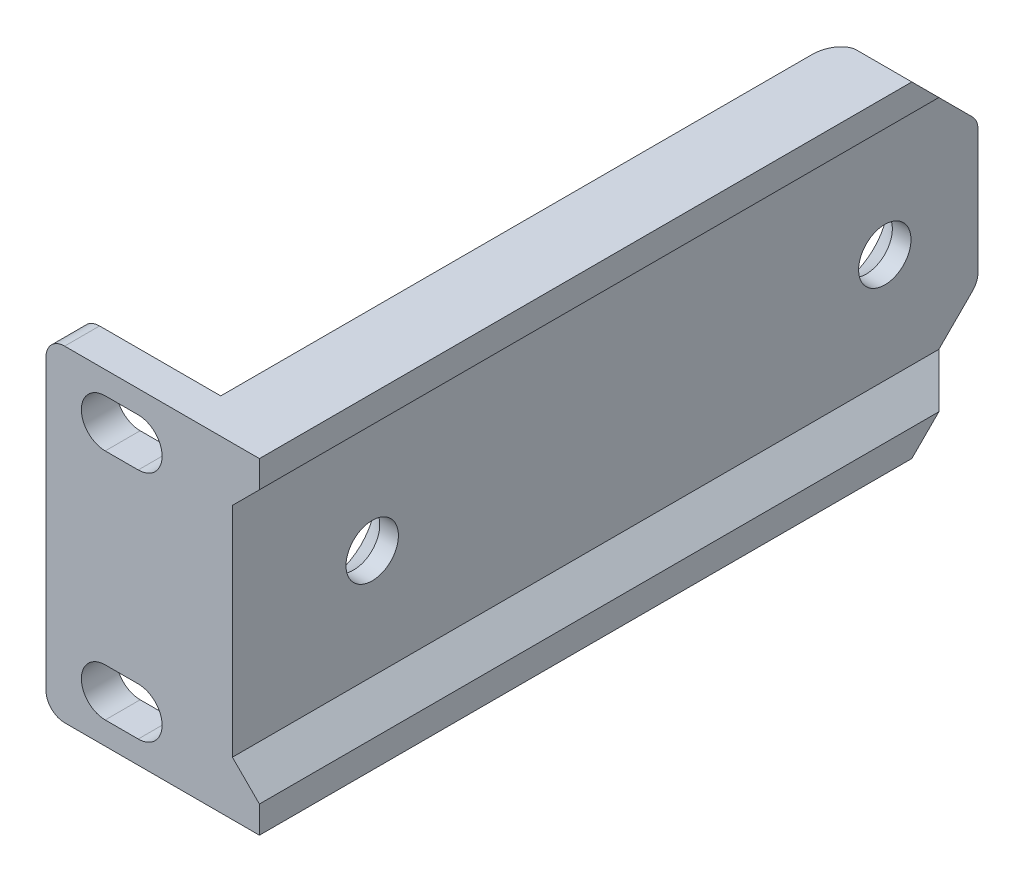
ISO-10303-21;
HEADER;
FILE_DESCRIPTION(('STEP AP214'),'2;1');
FILE_NAME('part.step','',(''),(''),'','','');
FILE_SCHEMA(('AUTOMOTIVE_DESIGN { 1 0 10303 214 1 1 1 1 }'));
ENDSEC;
DATA;
#1=APPLICATION_CONTEXT('core data for automotive mechanical design processes');
#2=APPLICATION_PROTOCOL_DEFINITION('international standard','automotive_design',2000,#1);
#3=PRODUCT_CONTEXT('',#1,'mechanical');
#4=PRODUCT('Part','Part','',(#3));
#5=PRODUCT_RELATED_PRODUCT_CATEGORY('part','',(#4));
#6=PRODUCT_DEFINITION_FORMATION('','',#4);
#7=PRODUCT_DEFINITION_CONTEXT('part definition',#1,'design');
#8=PRODUCT_DEFINITION('design','',#6,#7);
#9=PRODUCT_DEFINITION_SHAPE('','',#8);
#10=(LENGTH_UNIT() NAMED_UNIT(*) SI_UNIT(.MILLI.,.METRE.));
#11=(NAMED_UNIT(*) PLANE_ANGLE_UNIT() SI_UNIT($,.RADIAN.));
#12=(NAMED_UNIT(*) SI_UNIT($,.STERADIAN.) SOLID_ANGLE_UNIT());
#13=UNCERTAINTY_MEASURE_WITH_UNIT(LENGTH_MEASURE(1.E-05),#10,'distance_accuracy_value','');
#14=(GEOMETRIC_REPRESENTATION_CONTEXT(3) GLOBAL_UNCERTAINTY_ASSIGNED_CONTEXT((#13)) GLOBAL_UNIT_ASSIGNED_CONTEXT((#10,
#11,#12)) REPRESENTATION_CONTEXT('',''));
#15=CARTESIAN_POINT('',(0.,0.,0.));
#16=DIRECTION('',(0.,0.,1.));
#17=DIRECTION('',(1.,0.,0.));
#18=AXIS2_PLACEMENT_3D('',#15,#16,#17);
#19=CARTESIAN_POINT('',(-25.4,22.225,0.));
#20=DIRECTION('',(0.,0.,-1.));
#21=DIRECTION('',(-1.,0.,0.));
#22=AXIS2_PLACEMENT_3D('',#19,#20,#21);
#23=PLANE('',#22);
#24=DIRECTION('',(1.,0.,0.));
#25=VECTOR('',#24,1.);
#26=CARTESIAN_POINT('',(-17.33005,12.6238,0.));
#27=LINE('',#26,#25);
#28=CARTESIAN_POINT('',(-17.33005,12.6238,0.));
#29=VERTEX_POINT('',#28);
#30=CARTESIAN_POINT('',(-12.83245,12.6238,0.));
#31=VERTEX_POINT('',#30);
#32=EDGE_CURVE('E396',#29,#31,#27,.T.);
#33=ORIENTED_EDGE('',*,*,#32,.F.);
#34=CARTESIAN_POINT('',(-17.33005,15.875,0.));
#35=DIRECTION('',(0.,0.,1.));
#36=DIRECTION('',(1.,0.,0.));
#37=AXIS2_PLACEMENT_3D('',#34,#35,#36);
#38=CIRCLE('',#37,3.2512);
#39=CARTESIAN_POINT('',(-17.33005,19.1262,0.));
#40=VERTEX_POINT('',#39);
#41=EDGE_CURVE('E394',#40,#29,#38,.T.);
#42=ORIENTED_EDGE('',*,*,#41,.F.);
#43=DIRECTION('',(-1.,0.,0.));
#44=VECTOR('',#43,1.);
#45=CARTESIAN_POINT('',(-17.33005,19.1262,0.));
#46=LINE('',#45,#44);
#47=CARTESIAN_POINT('',(-12.83245,19.1262,0.));
#48=VERTEX_POINT('',#47);
#49=EDGE_CURVE('E403',#48,#40,#46,.T.);
#50=ORIENTED_EDGE('',*,*,#49,.F.);
#51=CARTESIAN_POINT('',(-12.83245,15.875,0.));
#52=DIRECTION('',(0.,0.,1.));
#53=DIRECTION('',(1.,0.,0.));
#54=AXIS2_PLACEMENT_3D('',#51,#52,#53);
#55=CIRCLE('',#54,3.2512);
#56=EDGE_CURVE('E400',#31,#48,#55,.T.);
#57=ORIENTED_EDGE('',*,*,#56,.F.);
#58=EDGE_LOOP('',(#33,#42,#50,#57));
#59=FACE_BOUND('',#58,.T.);
#60=DIRECTION('',(1.,0.,0.));
#61=VECTOR('',#60,1.);
#62=CARTESIAN_POINT('',(-17.33005,-19.1262,0.));
#63=LINE('',#62,#61);
#64=CARTESIAN_POINT('',(-17.33005,-19.1262,0.));
#65=VERTEX_POINT('',#64);
#66=CARTESIAN_POINT('',(-12.83245,-19.1262,0.));
#67=VERTEX_POINT('',#66);
#68=EDGE_CURVE('E417',#65,#67,#63,.T.);
#69=ORIENTED_EDGE('',*,*,#68,.F.);
#70=CARTESIAN_POINT('',(-17.33005,-15.875,0.));
#71=DIRECTION('',(0.,0.,1.));
#72=DIRECTION('',(-1.,0.,0.));
#73=AXIS2_PLACEMENT_3D('',#70,#71,#72);
#74=CIRCLE('',#73,3.2512);
#75=CARTESIAN_POINT('',(-17.33005,-12.6238,0.));
#76=VERTEX_POINT('',#75);
#77=EDGE_CURVE('E312',#76,#65,#74,.T.);
#78=ORIENTED_EDGE('',*,*,#77,.F.);
#79=DIRECTION('',(-1.,0.,0.));
#80=VECTOR('',#79,1.);
#81=CARTESIAN_POINT('',(-17.33005,-12.6238,0.));
#82=LINE('',#81,#80);
#83=CARTESIAN_POINT('',(-12.83245,-12.6238,0.));
#84=VERTEX_POINT('',#83);
#85=EDGE_CURVE('E423',#84,#76,#82,.T.);
#86=ORIENTED_EDGE('',*,*,#85,.F.);
#87=CARTESIAN_POINT('',(-12.83245,-15.875,0.));
#88=DIRECTION('',(0.,0.,1.));
#89=DIRECTION('',(-1.,0.,0.));
#90=AXIS2_PLACEMENT_3D('',#87,#88,#89);
#91=CIRCLE('',#90,3.2512);
#92=EDGE_CURVE('E420',#67,#84,#91,.T.);
#93=ORIENTED_EDGE('',*,*,#92,.F.);
#94=EDGE_LOOP('',(#69,#78,#86,#93));
#95=FACE_BOUND('',#94,.T.);
#96=DIRECTION('',(0.,-1.,0.));
#97=VECTOR('',#96,1.);
#98=CARTESIAN_POINT('',(-25.4,22.225,0.));
#99=LINE('',#98,#97);
#100=CARTESIAN_POINT('',(-25.4,19.685,0.));
#101=VERTEX_POINT('',#100);
#102=CARTESIAN_POINT('',(-25.4,-19.685,0.));
#103=VERTEX_POINT('',#102);
#104=EDGE_CURVE('E249',#101,#103,#99,.T.);
#105=ORIENTED_EDGE('',*,*,#104,.T.);
#106=CARTESIAN_POINT('',(-22.86,-19.685,0.));
#107=DIRECTION('',(0.,0.,-1.));
#108=DIRECTION('',(-1.,0.,0.));
#109=AXIS2_PLACEMENT_3D('',#106,#107,#108);
#110=CIRCLE('',#109,2.54);
#111=CARTESIAN_POINT('',(-22.86,-22.225,0.));
#112=VERTEX_POINT('',#111);
#113=EDGE_CURVE('E298',#103,#112,#110,.F.);
#114=ORIENTED_EDGE('',*,*,#113,.T.);
#115=DIRECTION('',(1.,0.,0.));
#116=VECTOR('',#115,1.);
#117=CARTESIAN_POINT('',(-25.4,-22.225,0.));
#118=LINE('',#117,#116);
#119=CARTESIAN_POINT('',(3.68300000000001,-22.225,0.));
#120=VERTEX_POINT('',#119);
#121=EDGE_CURVE('E233',#112,#120,#118,.T.);
#122=ORIENTED_EDGE('',*,*,#121,.T.);
#123=DIRECTION('',(0.,1.,0.));
#124=VECTOR('',#123,1.);
#125=CARTESIAN_POINT('',(3.68300000000001,-22.225,0.));
#126=LINE('',#125,#124);
#127=CARTESIAN_POINT('',(3.68300000000001,-18.542,0.));
#128=VERTEX_POINT('',#127);
#129=EDGE_CURVE('E409',#120,#128,#126,.T.);
#130=ORIENTED_EDGE('',*,*,#129,.T.);
#131=DIRECTION('',(-0.70710678118655,0.707106781186545,0.));
#132=VECTOR('',#131,1.);
#133=CARTESIAN_POINT('',(-31.2420000000001,16.3829999999999,0.));
#134=LINE('',#133,#132);
#135=CARTESIAN_POINT('',(0.,-14.859,0.));
#136=VERTEX_POINT('',#135);
#137=EDGE_CURVE('E57',#128,#136,#134,.T.);
#138=ORIENTED_EDGE('',*,*,#137,.T.);
#139=DIRECTION('',(0.,-1.,0.));
#140=VECTOR('',#139,1.);
#141=CARTESIAN_POINT('',(0.,22.225,0.));
#142=LINE('',#141,#140);
#143=CARTESIAN_POINT('',(0.,14.859,0.));
#144=VERTEX_POINT('',#143);
#145=EDGE_CURVE('E265',#144,#136,#142,.T.);
#146=ORIENTED_EDGE('',*,*,#145,.F.);
#147=DIRECTION('',(0.707106781186544,0.707106781186552,0.));
#148=VECTOR('',#147,1.);
#149=CARTESIAN_POINT('',(-9.01699999999984,5.84200000000002,0.));
#150=LINE('',#149,#148);
#151=CARTESIAN_POINT('',(3.683,18.542,0.));
#152=VERTEX_POINT('',#151);
#153=EDGE_CURVE('E42',#144,#152,#150,.T.);
#154=ORIENTED_EDGE('',*,*,#153,.T.);
#155=DIRECTION('',(0.,1.,0.));
#156=VECTOR('',#155,1.);
#157=CARTESIAN_POINT('',(3.683,22.225,0.));
#158=LINE('',#157,#156);
#159=CARTESIAN_POINT('',(3.683,22.225,0.));
#160=VERTEX_POINT('',#159);
#161=EDGE_CURVE('E238',#152,#160,#158,.T.);
#162=ORIENTED_EDGE('',*,*,#161,.T.);
#163=DIRECTION('',(1.,0.,0.));
#164=VECTOR('',#163,1.);
#165=CARTESIAN_POINT('',(-25.4,22.225,0.));
#166=LINE('',#165,#164);
#167=CARTESIAN_POINT('',(-22.86,22.225,0.));
#168=VERTEX_POINT('',#167);
#169=EDGE_CURVE('E231',#168,#160,#166,.T.);
#170=ORIENTED_EDGE('',*,*,#169,.F.);
#171=CARTESIAN_POINT('',(-22.86,19.685,0.));
#172=DIRECTION('',(0.,0.,-1.));
#173=DIRECTION('',(-1.,0.,0.));
#174=AXIS2_PLACEMENT_3D('',#171,#172,#173);
#175=CIRCLE('',#174,2.54);
#176=EDGE_CURVE('E296',#168,#101,#175,.F.);
#177=ORIENTED_EDGE('',*,*,#176,.T.);
#178=EDGE_LOOP('',(#105,#114,#122,#130,#138,#146,#154,#162,#170,#177));
#179=FACE_BOUND('',#178,.T.);
#180=ADVANCED_FACE('F34',(#59,#95,#179),#23,.F.);
#181=CARTESIAN_POINT('',(0.,22.225,0.));
#182=DIRECTION('',(-1.,0.,0.));
#183=DIRECTION('',(0.,0.,1.));
#184=AXIS2_PLACEMENT_3D('',#181,#182,#183);
#185=PLANE('',#184);
#186=CARTESIAN_POINT('',(0.,0.,-19.05));
#187=DIRECTION('',(-1.,0.,0.));
#188=DIRECTION('',(0.,0.,1.));
#189=AXIS2_PLACEMENT_3D('',#186,#187,#188);
#190=CIRCLE('',#189,3.57123999999999);
#191=CARTESIAN_POINT('',(0.,0.,-15.47876));
#192=VERTEX_POINT('',#191);
#193=EDGE_CURVE('E314',#192,#192,#190,.T.);
#194=ORIENTED_EDGE('',*,*,#193,.T.);
#195=EDGE_LOOP('',(#194));
#196=FACE_BOUND('',#195,.T.);
#197=CARTESIAN_POINT('',(0.,0.,-88.9));
#198=DIRECTION('',(-1.,0.,0.));
#199=DIRECTION('',(0.,0.,1.));
#200=AXIS2_PLACEMENT_3D('',#197,#198,#199);
#201=CIRCLE('',#200,3.57123999999999);
#202=CARTESIAN_POINT('',(0.,0.,-85.32876));
#203=VERTEX_POINT('',#202);
#204=EDGE_CURVE('E309',#203,#203,#201,.T.);
#205=ORIENTED_EDGE('',*,*,#204,.T.);
#206=EDGE_LOOP('',(#205));
#207=FACE_BOUND('',#206,.T.);
#208=ORIENTED_EDGE('',*,*,#145,.T.);
#209=DIRECTION('',(0.,0.,-1.));
#210=VECTOR('',#209,1.);
#211=CARTESIAN_POINT('',(0.,-14.859,0.));
#212=LINE('',#211,#210);
#213=CARTESIAN_POINT('',(0.,-14.859,-96.266));
#214=VERTEX_POINT('',#213);
#215=EDGE_CURVE('E49',#136,#214,#212,.T.);
#216=ORIENTED_EDGE('',*,*,#215,.T.);
#217=DIRECTION('',(0.,0.707106781186548,-0.707106781186548));
#218=VECTOR('',#217,1.);
#219=CARTESIAN_POINT('',(0.,-44.45,-66.675));
#220=LINE('',#219,#218);
#221=CARTESIAN_POINT('',(0.,-10.2689487757861,-100.856051224214));
#222=VERTEX_POINT('',#221);
#223=EDGE_CURVE('E216',#214,#222,#220,.T.);
#224=ORIENTED_EDGE('',*,*,#223,.T.);
#225=CARTESIAN_POINT('',(0.,-8.47289755157233,-99.06));
#226=DIRECTION('',(-1.,0.,0.));
#227=DIRECTION('',(0.,0.,1.));
#228=AXIS2_PLACEMENT_3D('',#225,#226,#227);
#229=CIRCLE('',#228,2.54);
#230=CARTESIAN_POINT('',(0.,-8.47289755157233,-101.6));
#231=VERTEX_POINT('',#230);
#232=EDGE_CURVE('E335',#222,#231,#229,.F.);
#233=ORIENTED_EDGE('',*,*,#232,.T.);
#234=DIRECTION('',(0.,-1.,0.));
#235=VECTOR('',#234,1.);
#236=CARTESIAN_POINT('',(0.,22.225,-101.6));
#237=LINE('',#236,#235);
#238=CARTESIAN_POINT('',(0.,8.47289755157233,-101.6));
#239=VERTEX_POINT('',#238);
#240=EDGE_CURVE('E262',#239,#231,#237,.T.);
#241=ORIENTED_EDGE('',*,*,#240,.F.);
#242=CARTESIAN_POINT('',(0.,8.47289755157233,-99.06));
#243=DIRECTION('',(-1.,0.,0.));
#244=DIRECTION('',(0.,0.,1.));
#245=AXIS2_PLACEMENT_3D('',#242,#243,#244);
#246=CIRCLE('',#245,2.54);
#247=CARTESIAN_POINT('',(0.,10.2689487757861,-100.856051224214));
#248=VERTEX_POINT('',#247);
#249=EDGE_CURVE('E337',#239,#248,#246,.F.);
#250=ORIENTED_EDGE('',*,*,#249,.T.);
#251=DIRECTION('',(0.,0.707106781186548,0.707106781186548));
#252=VECTOR('',#251,1.);
#253=CARTESIAN_POINT('',(0.,66.675,-44.45));
#254=LINE('',#253,#252);
#255=CARTESIAN_POINT('',(0.,14.859,-96.266));
#256=VERTEX_POINT('',#255);
#257=EDGE_CURVE('E376',#248,#256,#254,.T.);
#258=ORIENTED_EDGE('',*,*,#257,.T.);
#259=DIRECTION('',(0.,0.,1.));
#260=VECTOR('',#259,1.);
#261=CARTESIAN_POINT('',(0.,14.859,0.));
#262=LINE('',#261,#260);
#263=EDGE_CURVE('E346',#256,#144,#262,.T.);
#264=ORIENTED_EDGE('',*,*,#263,.T.);
#265=EDGE_LOOP('',(#208,#216,#224,#233,#241,#250,#258,#264));
#266=FACE_BOUND('',#265,.T.);
#267=ADVANCED_FACE('F378',(#196,#207,#266),#185,.F.);
#268=CARTESIAN_POINT('',(0.,22.225,-101.6));
#269=DIRECTION('',(0.,0.,1.));
#270=DIRECTION('',(1.,0.,0.));
#271=AXIS2_PLACEMENT_3D('',#268,#269,#270);
#272=PLANE('',#271);
#273=DIRECTION('',(0.,-1.,0.));
#274=VECTOR('',#273,1.);
#275=CARTESIAN_POINT('',(-3.81,22.225,-101.6));
#276=LINE('',#275,#274);
#277=CARTESIAN_POINT('',(-3.81,-8.47289755157233,-101.6));
#278=VERTEX_POINT('',#277);
#279=CARTESIAN_POINT('',(-3.81,8.47289755157233,-101.6));
#280=VERTEX_POINT('',#279);
#281=EDGE_CURVE('E329',#278,#280,#276,.F.);
#282=ORIENTED_EDGE('',*,*,#281,.T.);
#283=DIRECTION('',(-1.,0.,0.));
#284=VECTOR('',#283,1.);
#285=CARTESIAN_POINT('',(0.,8.47289755157233,-101.6));
#286=LINE('',#285,#284);
#287=EDGE_CURVE('E333',#280,#239,#286,.F.);
#288=ORIENTED_EDGE('',*,*,#287,.T.);
#289=ORIENTED_EDGE('',*,*,#240,.T.);
#290=DIRECTION('',(-1.,0.,0.));
#291=VECTOR('',#290,1.);
#292=CARTESIAN_POINT('',(0.,-8.47289755157233,-101.6));
#293=LINE('',#292,#291);
#294=EDGE_CURVE('E331',#231,#278,#293,.T.);
#295=ORIENTED_EDGE('',*,*,#294,.T.);
#296=EDGE_LOOP('',(#282,#288,#289,#295));
#297=FACE_BOUND('',#296,.T.);
#298=ADVANCED_FACE('F460',(#297),#272,.F.);
#299=CARTESIAN_POINT('',(-6.35,22.225,-101.6));
#300=DIRECTION('',(1.,0.,0.));
#301=DIRECTION('',(0.,0.,-1.));
#302=AXIS2_PLACEMENT_3D('',#299,#300,#301);
#303=PLANE('',#302);
#304=DIRECTION('',(0.,0.,1.));
#305=VECTOR('',#304,1.);
#306=CARTESIAN_POINT('',(-6.35,22.225,-101.6));
#307=LINE('',#306,#305);
#308=CARTESIAN_POINT('',(-6.35,22.225,-85.3078975515723));
#309=VERTEX_POINT('',#308);
#310=CARTESIAN_POINT('',(-6.34999999999999,22.225,-4.7625));
#311=VERTEX_POINT('',#310);
#312=EDGE_CURVE('E244',#309,#311,#307,.T.);
#313=ORIENTED_EDGE('',*,*,#312,.F.);
#314=DIRECTION('',(0.,0.707106781186548,0.707106781186548));
#315=VECTOR('',#314,1.);
#316=CARTESIAN_POINT('',(-6.35,14.0789487757862,-93.4539487757862));
#317=LINE('',#316,#315);
#318=CARTESIAN_POINT('',(-6.35,8.47289755157233,-99.06));
#319=VERTEX_POINT('',#318);
#320=EDGE_CURVE('E327',#309,#319,#317,.F.);
#321=ORIENTED_EDGE('',*,*,#320,.T.);
#322=DIRECTION('',(0.,-1.,0.));
#323=VECTOR('',#322,1.);
#324=CARTESIAN_POINT('',(-6.35,22.225,-99.06));
#325=LINE('',#324,#323);
#326=CARTESIAN_POINT('',(-6.35,-8.47289755157233,-99.06));
#327=VERTEX_POINT('',#326);
#328=EDGE_CURVE('E323',#319,#327,#325,.T.);
#329=ORIENTED_EDGE('',*,*,#328,.T.);
#330=DIRECTION('',(0.,0.707106781186548,-0.707106781186548));
#331=VECTOR('',#330,1.);
#332=CARTESIAN_POINT('',(-6.35,8.14605122421384,-115.678948775786));
#333=LINE('',#332,#331);
#334=CARTESIAN_POINT('',(-6.35,-22.225,-85.3078975515723));
#335=VERTEX_POINT('',#334);
#336=EDGE_CURVE('E325',#327,#335,#333,.F.);
#337=ORIENTED_EDGE('',*,*,#336,.T.);
#338=DIRECTION('',(0.,0.,1.));
#339=VECTOR('',#338,1.);
#340=CARTESIAN_POINT('',(-6.35,-22.225,-101.6));
#341=LINE('',#340,#339);
#342=CARTESIAN_POINT('',(-6.34999999999999,-22.225,-4.7625));
#343=VERTEX_POINT('',#342);
#344=EDGE_CURVE('E236',#335,#343,#341,.T.);
#345=ORIENTED_EDGE('',*,*,#344,.T.);
#346=DIRECTION('',(0.,-1.,0.));
#347=VECTOR('',#346,1.);
#348=CARTESIAN_POINT('',(-6.34999999999999,22.225,-4.7625));
#349=LINE('',#348,#347);
#350=EDGE_CURVE('E259',#311,#343,#349,.T.);
#351=ORIENTED_EDGE('',*,*,#350,.F.);
#352=EDGE_LOOP('',(#313,#321,#329,#337,#345,#351));
#353=FACE_BOUND('',#352,.T.);
#354=CARTESIAN_POINT('',(-6.34999999999999,0.,-19.05));
#355=DIRECTION('',(-1.,0.,0.));
#356=DIRECTION('',(0.,0.,1.));
#357=AXIS2_PLACEMENT_3D('',#354,#355,#356);
#358=CIRCLE('',#357,6.8804917);
#359=CARTESIAN_POINT('',(-6.34999999999999,0.,-12.1695083));
#360=VERTEX_POINT('',#359);
#361=EDGE_CURVE('E381',#360,#360,#358,.T.);
#362=ORIENTED_EDGE('',*,*,#361,.F.);
#363=EDGE_LOOP('',(#362));
#364=FACE_BOUND('',#363,.T.);
#365=CARTESIAN_POINT('',(-6.34999999999999,0.,-88.9));
#366=DIRECTION('',(-1.,0.,0.));
#367=DIRECTION('',(0.,0.,1.));
#368=AXIS2_PLACEMENT_3D('',#365,#366,#367);
#369=CIRCLE('',#368,6.8804917);
#370=CARTESIAN_POINT('',(-6.34999999999999,0.,-82.0195083));
#371=VERTEX_POINT('',#370);
#372=EDGE_CURVE('E317',#371,#371,#369,.T.);
#373=ORIENTED_EDGE('',*,*,#372,.F.);
#374=EDGE_LOOP('',(#373));
#375=FACE_BOUND('',#374,.T.);
#376=ADVANCED_FACE('F485',(#353,#364,#375),#303,.F.);
#377=CARTESIAN_POINT('',(-6.34999999999999,22.225,-4.7625));
#378=DIRECTION('',(0.,0.,1.));
#379=DIRECTION('',(1.,0.,0.));
#380=AXIS2_PLACEMENT_3D('',#377,#378,#379);
#381=PLANE('',#380);
#382=DIRECTION('',(-1.,0.,0.));
#383=VECTOR('',#382,1.);
#384=CARTESIAN_POINT('',(-6.34999999999999,19.1262,-4.7625));
#385=LINE('',#384,#383);
#386=CARTESIAN_POINT('',(-12.83245,19.1262,-4.7625));
#387=VERTEX_POINT('',#386);
#388=CARTESIAN_POINT('',(-17.33005,19.1262,-4.7625));
#389=VERTEX_POINT('',#388);
#390=EDGE_CURVE('E285',#387,#389,#385,.T.);
#391=ORIENTED_EDGE('',*,*,#390,.T.);
#392=CARTESIAN_POINT('',(-17.33005,15.875,-4.7625));
#393=DIRECTION('',(0.,0.,1.));
#394=DIRECTION('',(1.,0.,0.));
#395=AXIS2_PLACEMENT_3D('',#392,#393,#394);
#396=CIRCLE('',#395,3.2512);
#397=CARTESIAN_POINT('',(-17.33005,12.6238,-4.7625));
#398=VERTEX_POINT('',#397);
#399=EDGE_CURVE('E288',#389,#398,#396,.T.);
#400=ORIENTED_EDGE('',*,*,#399,.T.);
#401=DIRECTION('',(1.,0.,0.));
#402=VECTOR('',#401,1.);
#403=CARTESIAN_POINT('',(-6.34999999999999,12.6238,-4.7625));
#404=LINE('',#403,#402);
#405=CARTESIAN_POINT('',(-12.83245,12.6238,-4.7625));
#406=VERTEX_POINT('',#405);
#407=EDGE_CURVE('E279',#398,#406,#404,.T.);
#408=ORIENTED_EDGE('',*,*,#407,.T.);
#409=CARTESIAN_POINT('',(-12.83245,15.875,-4.7625));
#410=DIRECTION('',(0.,0.,1.));
#411=DIRECTION('',(1.,0.,0.));
#412=AXIS2_PLACEMENT_3D('',#409,#410,#411);
#413=CIRCLE('',#412,3.2512);
#414=EDGE_CURVE('E282',#406,#387,#413,.T.);
#415=ORIENTED_EDGE('',*,*,#414,.T.);
#416=EDGE_LOOP('',(#391,#400,#408,#415));
#417=FACE_BOUND('',#416,.T.);
#418=DIRECTION('',(-1.,0.,0.));
#419=VECTOR('',#418,1.);
#420=CARTESIAN_POINT('',(-6.34999999999999,-12.6238,-4.7625));
#421=LINE('',#420,#419);
#422=CARTESIAN_POINT('',(-12.83245,-12.6238,-4.7625));
#423=VERTEX_POINT('',#422);
#424=CARTESIAN_POINT('',(-17.33005,-12.6238,-4.7625));
#425=VERTEX_POINT('',#424);
#426=EDGE_CURVE('E273',#423,#425,#421,.T.);
#427=ORIENTED_EDGE('',*,*,#426,.T.);
#428=CARTESIAN_POINT('',(-17.33005,-15.875,-4.7625));
#429=DIRECTION('',(0.,0.,1.));
#430=DIRECTION('',(1.,0.,0.));
#431=AXIS2_PLACEMENT_3D('',#428,#429,#430);
#432=CIRCLE('',#431,3.2512);
#433=CARTESIAN_POINT('',(-17.33005,-19.1262,-4.7625));
#434=VERTEX_POINT('',#433);
#435=EDGE_CURVE('E276',#425,#434,#432,.T.);
#436=ORIENTED_EDGE('',*,*,#435,.T.);
#437=DIRECTION('',(1.,0.,0.));
#438=VECTOR('',#437,1.);
#439=CARTESIAN_POINT('',(-6.34999999999999,-19.1262,-4.7625));
#440=LINE('',#439,#438);
#441=CARTESIAN_POINT('',(-12.83245,-19.1262,-4.7625));
#442=VERTEX_POINT('',#441);
#443=EDGE_CURVE('E267',#434,#442,#440,.T.);
#444=ORIENTED_EDGE('',*,*,#443,.T.);
#445=CARTESIAN_POINT('',(-12.83245,-15.875,-4.7625));
#446=DIRECTION('',(0.,0.,1.));
#447=DIRECTION('',(1.,0.,0.));
#448=AXIS2_PLACEMENT_3D('',#445,#446,#447);
#449=CIRCLE('',#448,3.2512);
#450=EDGE_CURVE('E270',#442,#423,#449,.T.);
#451=ORIENTED_EDGE('',*,*,#450,.T.);
#452=EDGE_LOOP('',(#427,#436,#444,#451));
#453=FACE_BOUND('',#452,.T.);
#454=DIRECTION('',(-1.,0.,0.));
#455=VECTOR('',#454,1.);
#456=CARTESIAN_POINT('',(-6.34999999999999,-22.225,-4.7625));
#457=LINE('',#456,#455);
#458=CARTESIAN_POINT('',(-22.86,-22.225,-4.7625));
#459=VERTEX_POINT('',#458);
#460=EDGE_CURVE('E245',#343,#459,#457,.T.);
#461=ORIENTED_EDGE('',*,*,#460,.T.);
#462=CARTESIAN_POINT('',(-22.86,-19.685,-4.7625));
#463=DIRECTION('',(0.,0.,1.));
#464=DIRECTION('',(1.,0.,0.));
#465=AXIS2_PLACEMENT_3D('',#462,#463,#464);
#466=CIRCLE('',#465,2.54);
#467=CARTESIAN_POINT('',(-25.4,-19.685,-4.7625));
#468=VERTEX_POINT('',#467);
#469=EDGE_CURVE('E304',#459,#468,#466,.F.);
#470=ORIENTED_EDGE('',*,*,#469,.T.);
#471=DIRECTION('',(0.,-1.,0.));
#472=VECTOR('',#471,1.);
#473=CARTESIAN_POINT('',(-25.4,22.225,-4.7625));
#474=LINE('',#473,#472);
#475=CARTESIAN_POINT('',(-25.4,19.685,-4.7625));
#476=VERTEX_POINT('',#475);
#477=EDGE_CURVE('E256',#476,#468,#474,.T.);
#478=ORIENTED_EDGE('',*,*,#477,.F.);
#479=CARTESIAN_POINT('',(-22.86,19.685,-4.7625));
#480=DIRECTION('',(0.,0.,1.));
#481=DIRECTION('',(1.,0.,0.));
#482=AXIS2_PLACEMENT_3D('',#479,#480,#481);
#483=CIRCLE('',#482,2.54);
#484=CARTESIAN_POINT('',(-22.86,22.225,-4.7625));
#485=VERTEX_POINT('',#484);
#486=EDGE_CURVE('E302',#476,#485,#483,.F.);
#487=ORIENTED_EDGE('',*,*,#486,.T.);
#488=DIRECTION('',(-1.,0.,0.));
#489=VECTOR('',#488,1.);
#490=CARTESIAN_POINT('',(-6.34999999999999,22.225,-4.7625));
#491=LINE('',#490,#489);
#492=EDGE_CURVE('E247',#311,#485,#491,.T.);
#493=ORIENTED_EDGE('',*,*,#492,.F.);
#494=ORIENTED_EDGE('',*,*,#350,.T.);
#495=EDGE_LOOP('',(#461,#470,#478,#487,#493,#494));
#496=FACE_BOUND('',#495,.T.);
#497=ADVANCED_FACE('F490',(#417,#453,#496),#381,.F.);
#498=CARTESIAN_POINT('',(-25.4,22.225,-4.7625));
#499=DIRECTION('',(1.,0.,0.));
#500=DIRECTION('',(0.,0.,-1.));
#501=AXIS2_PLACEMENT_3D('',#498,#499,#500);
#502=PLANE('',#501);
#503=ORIENTED_EDGE('',*,*,#477,.T.);
#504=DIRECTION('',(0.,0.,1.));
#505=VECTOR('',#504,1.);
#506=CARTESIAN_POINT('',(-25.4,-19.685,-4.7625));
#507=LINE('',#506,#505);
#508=EDGE_CURVE('E293',#468,#103,#507,.T.);
#509=ORIENTED_EDGE('',*,*,#508,.T.);
#510=ORIENTED_EDGE('',*,*,#104,.F.);
#511=DIRECTION('',(0.,0.,1.));
#512=VECTOR('',#511,1.);
#513=CARTESIAN_POINT('',(-25.4,19.685,-4.7625));
#514=LINE('',#513,#512);
#515=EDGE_CURVE('E291',#101,#476,#514,.F.);
#516=ORIENTED_EDGE('',*,*,#515,.T.);
#517=EDGE_LOOP('',(#503,#509,#510,#516));
#518=FACE_BOUND('',#517,.T.);
#519=ADVANCED_FACE('F499',(#518),#502,.F.);
#520=CARTESIAN_POINT('',(0.,22.225,0.));
#521=DIRECTION('',(0.,1.,0.));
#522=DIRECTION('',(0.,0.,1.));
#523=AXIS2_PLACEMENT_3D('',#520,#521,#522);
#524=PLANE('',#523);
#525=DIRECTION('',(-1.,0.,0.));
#526=VECTOR('',#525,1.);
#527=CARTESIAN_POINT('',(3.68300000000001,22.225,-88.9));
#528=LINE('',#527,#526);
#529=CARTESIAN_POINT('',(3.68300000000001,22.225,-88.9));
#530=VERTEX_POINT('',#529);
#531=CARTESIAN_POINT('',(-3.81,22.225,-88.9));
#532=VERTEX_POINT('',#531);
#533=EDGE_CURVE('E207',#530,#532,#528,.T.);
#534=ORIENTED_EDGE('',*,*,#533,.T.);
#535=CARTESIAN_POINT('',(-3.81,22.225,-85.3078975515723));
#536=DIRECTION('',(0.,1.,0.));
#537=DIRECTION('',(0.,0.,1.));
#538=AXIS2_PLACEMENT_3D('',#535,#536,#537);
#539=ELLIPSE('',#538,3.59210244842766,2.54);
#540=EDGE_CURVE('E321',#532,#309,#539,.T.);
#541=ORIENTED_EDGE('',*,*,#540,.T.);
#542=ORIENTED_EDGE('',*,*,#312,.T.);
#543=ORIENTED_EDGE('',*,*,#492,.T.);
#544=DIRECTION('',(0.,0.,1.));
#545=VECTOR('',#544,1.);
#546=CARTESIAN_POINT('',(-22.86,22.225,0.));
#547=LINE('',#546,#545);
#548=EDGE_CURVE('E306',#485,#168,#547,.T.);
#549=ORIENTED_EDGE('',*,*,#548,.T.);
#550=ORIENTED_EDGE('',*,*,#169,.T.);
#551=DIRECTION('',(0.,0.,1.));
#552=VECTOR('',#551,1.);
#553=CARTESIAN_POINT('',(3.683,22.225,-106.80854855022));
#554=LINE('',#553,#552);
#555=EDGE_CURVE('E221',#530,#160,#554,.T.);
#556=ORIENTED_EDGE('',*,*,#555,.F.);
#557=EDGE_LOOP('',(#534,#541,#542,#543,#549,#550,#556));
#558=FACE_BOUND('',#557,.T.);
#559=ADVANCED_FACE('F228',(#558),#524,.T.);
#560=CARTESIAN_POINT('',(0.,-22.225,0.));
#561=DIRECTION('',(0.,1.,0.));
#562=DIRECTION('',(0.,0.,1.));
#563=AXIS2_PLACEMENT_3D('',#560,#561,#562);
#564=PLANE('',#563);
#565=ORIENTED_EDGE('',*,*,#344,.F.);
#566=CARTESIAN_POINT('',(-3.81,-22.225,-85.3078975515723));
#567=DIRECTION('',(0.,1.,0.));
#568=DIRECTION('',(0.,0.,-1.));
#569=AXIS2_PLACEMENT_3D('',#566,#567,#568);
#570=ELLIPSE('',#569,3.59210244842766,2.54);
#571=CARTESIAN_POINT('',(-3.81,-22.225,-88.9));
#572=VERTEX_POINT('',#571);
#573=EDGE_CURVE('E344',#335,#572,#570,.F.);
#574=ORIENTED_EDGE('',*,*,#573,.T.);
#575=DIRECTION('',(-1.,0.,0.));
#576=VECTOR('',#575,1.);
#577=CARTESIAN_POINT('',(3.68300000000001,-22.225,-88.9));
#578=LINE('',#577,#576);
#579=CARTESIAN_POINT('',(3.68300000000001,-22.225,-88.9));
#580=VERTEX_POINT('',#579);
#581=EDGE_CURVE('E226',#580,#572,#578,.T.);
#582=ORIENTED_EDGE('',*,*,#581,.F.);
#583=DIRECTION('',(0.,0.,1.));
#584=VECTOR('',#583,1.);
#585=CARTESIAN_POINT('',(3.68300000000001,-22.225,-106.80854855022));
#586=LINE('',#585,#584);
#587=EDGE_CURVE('E435',#580,#120,#586,.T.);
#588=ORIENTED_EDGE('',*,*,#587,.T.);
#589=ORIENTED_EDGE('',*,*,#121,.F.);
#590=DIRECTION('',(0.,0.,1.));
#591=VECTOR('',#590,1.);
#592=CARTESIAN_POINT('',(-22.86,-22.225,0.));
#593=LINE('',#592,#591);
#594=EDGE_CURVE('E300',#112,#459,#593,.F.);
#595=ORIENTED_EDGE('',*,*,#594,.T.);
#596=ORIENTED_EDGE('',*,*,#460,.F.);
#597=EDGE_LOOP('',(#565,#574,#582,#588,#589,#595,#596));
#598=FACE_BOUND('',#597,.T.);
#599=ADVANCED_FACE('F442',(#598),#564,.F.);
#600=CARTESIAN_POINT('',(3.683,22.225,-106.80854855022));
#601=DIRECTION('',(1.,0.,0.));
#602=DIRECTION('',(0.,1.,0.));
#603=AXIS2_PLACEMENT_3D('',#600,#601,#602);
#604=PLANE('',#603);
#605=DIRECTION('',(0.,0.707106781186547,0.707106781186547));
#606=VECTOR('',#605,1.);
#607=CARTESIAN_POINT('',(3.68300000000001,22.225,-88.9));
#608=LINE('',#607,#606);
#609=CARTESIAN_POINT('',(3.683,18.542,-92.583));
#610=VERTEX_POINT('',#609);
#611=EDGE_CURVE('E210',#610,#530,#608,.T.);
#612=ORIENTED_EDGE('',*,*,#611,.T.);
#613=ORIENTED_EDGE('',*,*,#555,.T.);
#614=ORIENTED_EDGE('',*,*,#161,.F.);
#615=DIRECTION('',(0.,0.,1.));
#616=VECTOR('',#615,1.);
#617=CARTESIAN_POINT('',(3.683,18.542,-106.80854855022));
#618=LINE('',#617,#616);
#619=EDGE_CURVE('E224',#610,#152,#618,.T.);
#620=ORIENTED_EDGE('',*,*,#619,.F.);
#621=EDGE_LOOP('',(#612,#613,#614,#620));
#622=FACE_BOUND('',#621,.T.);
#623=ADVANCED_FACE('F219',(#622),#604,.T.);
#624=CARTESIAN_POINT('',(3.68300000000001,-22.225,-106.80854855022));
#625=DIRECTION('',(1.,0.,0.));
#626=DIRECTION('',(0.,0.,-1.));
#627=AXIS2_PLACEMENT_3D('',#624,#625,#626);
#628=PLANE('',#627);
#629=DIRECTION('',(0.,0.707106781186547,-0.707106781186547));
#630=VECTOR('',#629,1.);
#631=CARTESIAN_POINT('',(3.68300000000001,-22.225,-88.9));
#632=LINE('',#631,#630);
#633=CARTESIAN_POINT('',(3.68300000000001,-18.542,-92.583));
#634=VERTEX_POINT('',#633);
#635=EDGE_CURVE('E365',#580,#634,#632,.T.);
#636=ORIENTED_EDGE('',*,*,#635,.T.);
#637=DIRECTION('',(0.,0.,1.));
#638=VECTOR('',#637,1.);
#639=CARTESIAN_POINT('',(3.68300000000001,-18.542,-106.80854855022));
#640=LINE('',#639,#638);
#641=EDGE_CURVE('E373',#634,#128,#640,.T.);
#642=ORIENTED_EDGE('',*,*,#641,.T.);
#643=ORIENTED_EDGE('',*,*,#129,.F.);
#644=ORIENTED_EDGE('',*,*,#587,.F.);
#645=EDGE_LOOP('',(#636,#642,#643,#644));
#646=FACE_BOUND('',#645,.T.);
#647=ADVANCED_FACE('F448',(#646),#628,.T.);
#648=CARTESIAN_POINT('',(-17.33005,-15.875,-101.6));
#649=DIRECTION('',(0.,0.,1.));
#650=DIRECTION('',(1.,0.,0.));
#651=AXIS2_PLACEMENT_3D('',#648,#649,#650);
#652=CYLINDRICAL_SURFACE('',#651,3.2512);
#653=DIRECTION('',(0.,0.,1.));
#654=VECTOR('',#653,1.);
#655=CARTESIAN_POINT('',(-17.33005,-12.6238,-101.6));
#656=LINE('',#655,#654);
#657=EDGE_CURVE('E397',#425,#76,#656,.T.);
#658=ORIENTED_EDGE('',*,*,#657,.T.);
#659=ORIENTED_EDGE('',*,*,#77,.T.);
#660=DIRECTION('',(0.,0.,1.));
#661=VECTOR('',#660,1.);
#662=CARTESIAN_POINT('',(-17.33005,-19.1262,-101.6));
#663=LINE('',#662,#661);
#664=EDGE_CURVE('E426',#434,#65,#663,.T.);
#665=ORIENTED_EDGE('',*,*,#664,.F.);
#666=ORIENTED_EDGE('',*,*,#435,.F.);
#667=EDGE_LOOP('',(#658,#659,#665,#666));
#668=FACE_BOUND('',#667,.T.);
#669=ADVANCED_FACE('F720',(#668),#652,.F.);
#670=CARTESIAN_POINT('',(-17.33005,-12.6238,-101.6));
#671=DIRECTION('',(0.,1.,0.));
#672=DIRECTION('',(0.,0.,1.));
#673=AXIS2_PLACEMENT_3D('',#670,#671,#672);
#674=PLANE('',#673);
#675=DIRECTION('',(0.,0.,1.));
#676=VECTOR('',#675,1.);
#677=CARTESIAN_POINT('',(-12.83245,-12.6238,-101.6));
#678=LINE('',#677,#676);
#679=EDGE_CURVE('E428',#423,#84,#678,.T.);
#680=ORIENTED_EDGE('',*,*,#679,.T.);
#681=ORIENTED_EDGE('',*,*,#85,.T.);
#682=ORIENTED_EDGE('',*,*,#657,.F.);
#683=ORIENTED_EDGE('',*,*,#426,.F.);
#684=EDGE_LOOP('',(#680,#681,#682,#683));
#685=FACE_BOUND('',#684,.T.);
#686=ADVANCED_FACE('F711',(#685),#674,.F.);
#687=CARTESIAN_POINT('',(-12.83245,-15.875,-101.6));
#688=DIRECTION('',(0.,0.,1.));
#689=DIRECTION('',(1.,0.,0.));
#690=AXIS2_PLACEMENT_3D('',#687,#688,#689);
#691=CYLINDRICAL_SURFACE('',#690,3.2512);
#692=DIRECTION('',(0.,0.,1.));
#693=VECTOR('',#692,1.);
#694=CARTESIAN_POINT('',(-12.83245,-19.1262,-101.6));
#695=LINE('',#694,#693);
#696=EDGE_CURVE('E430',#442,#67,#695,.T.);
#697=ORIENTED_EDGE('',*,*,#696,.T.);
#698=ORIENTED_EDGE('',*,*,#92,.T.);
#699=ORIENTED_EDGE('',*,*,#679,.F.);
#700=ORIENTED_EDGE('',*,*,#450,.F.);
#701=EDGE_LOOP('',(#697,#698,#699,#700));
#702=FACE_BOUND('',#701,.T.);
#703=ADVANCED_FACE('F702',(#702),#691,.F.);
#704=CARTESIAN_POINT('',(-17.33005,-19.1262,-101.6));
#705=DIRECTION('',(0.,-1.,0.));
#706=DIRECTION('',(0.,0.,-1.));
#707=AXIS2_PLACEMENT_3D('',#704,#705,#706);
#708=PLANE('',#707);
#709=ORIENTED_EDGE('',*,*,#664,.T.);
#710=ORIENTED_EDGE('',*,*,#68,.T.);
#711=ORIENTED_EDGE('',*,*,#696,.F.);
#712=ORIENTED_EDGE('',*,*,#443,.F.);
#713=EDGE_LOOP('',(#709,#710,#711,#712));
#714=FACE_BOUND('',#713,.T.);
#715=ADVANCED_FACE('F693',(#714),#708,.F.);
#716=CARTESIAN_POINT('',(-17.33005,15.875,-101.6));
#717=DIRECTION('',(0.,0.,1.));
#718=DIRECTION('',(1.,0.,0.));
#719=AXIS2_PLACEMENT_3D('',#716,#717,#718);
#720=CYLINDRICAL_SURFACE('',#719,3.2512);
#721=DIRECTION('',(0.,0.,1.));
#722=VECTOR('',#721,1.);
#723=CARTESIAN_POINT('',(-17.33005,19.1262,-101.6));
#724=LINE('',#723,#722);
#725=EDGE_CURVE('E407',#389,#40,#724,.T.);
#726=ORIENTED_EDGE('',*,*,#725,.T.);
#727=ORIENTED_EDGE('',*,*,#41,.T.);
#728=DIRECTION('',(0.,0.,1.));
#729=VECTOR('',#728,1.);
#730=CARTESIAN_POINT('',(-17.33005,12.6238,-101.6));
#731=LINE('',#730,#729);
#732=EDGE_CURVE('E406',#398,#29,#731,.T.);
#733=ORIENTED_EDGE('',*,*,#732,.F.);
#734=ORIENTED_EDGE('',*,*,#399,.F.);
#735=EDGE_LOOP('',(#726,#727,#733,#734));
#736=FACE_BOUND('',#735,.T.);
#737=ADVANCED_FACE('F684',(#736),#720,.F.);
#738=CARTESIAN_POINT('',(-17.33005,19.1262,-101.6));
#739=DIRECTION('',(0.,1.,0.));
#740=DIRECTION('',(0.,0.,1.));
#741=AXIS2_PLACEMENT_3D('',#738,#739,#740);
#742=PLANE('',#741);
#743=DIRECTION('',(0.,0.,1.));
#744=VECTOR('',#743,1.);
#745=CARTESIAN_POINT('',(-12.83245,19.1262,-101.6));
#746=LINE('',#745,#744);
#747=EDGE_CURVE('E410',#387,#48,#746,.T.);
#748=ORIENTED_EDGE('',*,*,#747,.T.);
#749=ORIENTED_EDGE('',*,*,#49,.T.);
#750=ORIENTED_EDGE('',*,*,#725,.F.);
#751=ORIENTED_EDGE('',*,*,#390,.F.);
#752=EDGE_LOOP('',(#748,#749,#750,#751));
#753=FACE_BOUND('',#752,.T.);
#754=ADVANCED_FACE('F675',(#753),#742,.F.);
#755=CARTESIAN_POINT('',(-12.83245,15.875,-101.6));
#756=DIRECTION('',(0.,0.,1.));
#757=DIRECTION('',(1.,0.,0.));
#758=AXIS2_PLACEMENT_3D('',#755,#756,#757);
#759=CYLINDRICAL_SURFACE('',#758,3.2512);
#760=DIRECTION('',(0.,0.,1.));
#761=VECTOR('',#760,1.);
#762=CARTESIAN_POINT('',(-12.83245,12.6238,-101.6));
#763=LINE('',#762,#761);
#764=EDGE_CURVE('E412',#406,#31,#763,.T.);
#765=ORIENTED_EDGE('',*,*,#764,.T.);
#766=ORIENTED_EDGE('',*,*,#56,.T.);
#767=ORIENTED_EDGE('',*,*,#747,.F.);
#768=ORIENTED_EDGE('',*,*,#414,.F.);
#769=EDGE_LOOP('',(#765,#766,#767,#768));
#770=FACE_BOUND('',#769,.T.);
#771=ADVANCED_FACE('F665',(#770),#759,.F.);
#772=CARTESIAN_POINT('',(-17.33005,12.6238,-101.6));
#773=DIRECTION('',(0.,-1.,0.));
#774=DIRECTION('',(0.,0.,-1.));
#775=AXIS2_PLACEMENT_3D('',#772,#773,#774);
#776=PLANE('',#775);
#777=ORIENTED_EDGE('',*,*,#732,.T.);
#778=ORIENTED_EDGE('',*,*,#32,.T.);
#779=ORIENTED_EDGE('',*,*,#764,.F.);
#780=ORIENTED_EDGE('',*,*,#407,.F.);
#781=EDGE_LOOP('',(#777,#778,#779,#780));
#782=FACE_BOUND('',#781,.T.);
#783=ADVANCED_FACE('F534',(#782),#776,.F.);
#784=CARTESIAN_POINT('',(-22.86,-19.685,-4.7625));
#785=DIRECTION('',(0.,0.,1.));
#786=DIRECTION('',(1.,0.,0.));
#787=AXIS2_PLACEMENT_3D('',#784,#785,#786);
#788=CYLINDRICAL_SURFACE('',#787,2.54);
#789=ORIENTED_EDGE('',*,*,#469,.F.);
#790=ORIENTED_EDGE('',*,*,#594,.F.);
#791=ORIENTED_EDGE('',*,*,#113,.F.);
#792=ORIENTED_EDGE('',*,*,#508,.F.);
#793=EDGE_LOOP('',(#789,#790,#791,#792));
#794=FACE_BOUND('',#793,.T.);
#795=ADVANCED_FACE('F503',(#794),#788,.T.);
#796=CARTESIAN_POINT('',(-22.86,19.685,0.));
#797=DIRECTION('',(0.,0.,-1.));
#798=DIRECTION('',(-1.,0.,0.));
#799=AXIS2_PLACEMENT_3D('',#796,#797,#798);
#800=CYLINDRICAL_SURFACE('',#799,2.54);
#801=ORIENTED_EDGE('',*,*,#486,.F.);
#802=ORIENTED_EDGE('',*,*,#515,.F.);
#803=ORIENTED_EDGE('',*,*,#176,.F.);
#804=ORIENTED_EDGE('',*,*,#548,.F.);
#805=EDGE_LOOP('',(#801,#802,#803,#804));
#806=FACE_BOUND('',#805,.T.);
#807=ADVANCED_FACE('F495',(#806),#800,.T.);
#808=CARTESIAN_POINT('',(-6.34999999999999,0.,-88.9));
#809=DIRECTION('',(-1.,0.,0.));
#810=DIRECTION('',(0.,0.,1.));
#811=AXIS2_PLACEMENT_3D('',#808,#809,#810);
#812=CYLINDRICAL_SURFACE('',#811,3.57123999999999);
#813=CARTESIAN_POINT('',(-2.54314139277757,0.,-88.9));
#814=DIRECTION('',(-1.,0.,0.));
#815=DIRECTION('',(0.,0.,1.));
#816=AXIS2_PLACEMENT_3D('',#813,#814,#815);
#817=CIRCLE('',#816,3.57123999999999);
#818=CARTESIAN_POINT('',(-2.54314139277757,0.,-85.32876));
#819=VERTEX_POINT('',#818);
#820=EDGE_CURVE('E313',#819,#819,#817,.T.);
#821=ORIENTED_EDGE('',*,*,#820,.T.);
#822=EDGE_LOOP('',(#821));
#823=FACE_BOUND('',#822,.T.);
#824=ORIENTED_EDGE('',*,*,#204,.F.);
#825=EDGE_LOOP('',(#824));
#826=FACE_BOUND('',#825,.T.);
#827=ADVANCED_FACE('F537',(#823,#826),#812,.F.);
#828=CARTESIAN_POINT('',(-6.34999999999999,0.,-88.9));
#829=DIRECTION('',(-1.,0.,0.));
#830=DIRECTION('',(0.,0.,1.));
#831=AXIS2_PLACEMENT_3D('',#828,#829,#830);
#832=CONICAL_SURFACE('',#831,6.8804917,0.715584993317676);
#833=ORIENTED_EDGE('',*,*,#820,.F.);
#834=EDGE_LOOP('',(#833));
#835=FACE_BOUND('',#834,.T.);
#836=ORIENTED_EDGE('',*,*,#372,.T.);
#837=EDGE_LOOP('',(#836));
#838=FACE_BOUND('',#837,.T.);
#839=ADVANCED_FACE('F629',(#835,#838),#832,.F.);
#840=CARTESIAN_POINT('',(-6.34999999999999,0.,-19.05));
#841=DIRECTION('',(-1.,0.,0.));
#842=DIRECTION('',(0.,0.,1.));
#843=AXIS2_PLACEMENT_3D('',#840,#841,#842);
#844=CYLINDRICAL_SURFACE('',#843,3.57123999999999);
#845=CARTESIAN_POINT('',(-2.54314139277757,0.,-19.05));
#846=DIRECTION('',(-1.,0.,0.));
#847=DIRECTION('',(0.,0.,1.));
#848=AXIS2_PLACEMENT_3D('',#845,#846,#847);
#849=CIRCLE('',#848,3.57123999999999);
#850=CARTESIAN_POINT('',(-2.54314139277757,0.,-15.47876));
#851=VERTEX_POINT('',#850);
#852=EDGE_CURVE('E318',#851,#851,#849,.T.);
#853=ORIENTED_EDGE('',*,*,#852,.T.);
#854=EDGE_LOOP('',(#853));
#855=FACE_BOUND('',#854,.T.);
#856=ORIENTED_EDGE('',*,*,#193,.F.);
#857=EDGE_LOOP('',(#856));
#858=FACE_BOUND('',#857,.T.);
#859=ADVANCED_FACE('F619',(#855,#858),#844,.F.);
#860=CARTESIAN_POINT('',(-6.34999999999999,0.,-19.05));
#861=DIRECTION('',(-1.,0.,0.));
#862=DIRECTION('',(0.,0.,1.));
#863=AXIS2_PLACEMENT_3D('',#860,#861,#862);
#864=CONICAL_SURFACE('',#863,6.8804917,0.715584993317676);
#865=ORIENTED_EDGE('',*,*,#852,.F.);
#866=EDGE_LOOP('',(#865));
#867=FACE_BOUND('',#866,.T.);
#868=ORIENTED_EDGE('',*,*,#361,.T.);
#869=EDGE_LOOP('',(#868));
#870=FACE_BOUND('',#869,.T.);
#871=ADVANCED_FACE('F611',(#867,#870),#864,.F.);
#872=CARTESIAN_POINT('',(3.68300000000001,-22.225,-88.9));
#873=DIRECTION('',(0.,0.707106781186548,0.707106781186548));
#874=DIRECTION('',(0.,-0.707106781186548,0.707106781186548));
#875=AXIS2_PLACEMENT_3D('',#872,#873,#874);
#876=PLANE('',#875);
#877=ORIENTED_EDGE('',*,*,#581,.T.);
#878=DIRECTION('',(0.,0.707106781186548,-0.707106781186548));
#879=VECTOR('',#878,1.);
#880=CARTESIAN_POINT('',(-3.81,-22.225,-88.9));
#881=LINE('',#880,#879);
#882=CARTESIAN_POINT('',(-3.81,-10.2689487757862,-100.856051224214));
#883=VERTEX_POINT('',#882);
#884=EDGE_CURVE('E342',#572,#883,#881,.T.);
#885=ORIENTED_EDGE('',*,*,#884,.T.);
#886=DIRECTION('',(-1.,0.,0.));
#887=VECTOR('',#886,1.);
#888=CARTESIAN_POINT('',(3.68300000000001,-10.2689487757862,-100.856051224214));
#889=LINE('',#888,#887);
#890=EDGE_CURVE('E339',#883,#222,#889,.F.);
#891=ORIENTED_EDGE('',*,*,#890,.T.);
#892=ORIENTED_EDGE('',*,*,#223,.F.);
#893=DIRECTION('',(0.577350269189629,-0.577350269189624,0.577350269189624));
#894=VECTOR('',#893,1.);
#895=CARTESIAN_POINT('',(6.13833333333335,-20.9973333333333,-90.1276666666667));
#896=LINE('',#895,#894);
#897=EDGE_CURVE('E370',#214,#634,#896,.T.);
#898=ORIENTED_EDGE('',*,*,#897,.T.);
#899=ORIENTED_EDGE('',*,*,#635,.F.);
#900=EDGE_LOOP('',(#877,#885,#891,#892,#898,#899));
#901=FACE_BOUND('',#900,.T.);
#902=ADVANCED_FACE('F454',(#901),#876,.F.);
#903=CARTESIAN_POINT('',(3.68300000000001,22.225,-88.9));
#904=DIRECTION('',(0.,-0.707106781186548,0.707106781186548));
#905=DIRECTION('',(0.,-0.707106781186548,-0.707106781186548));
#906=AXIS2_PLACEMENT_3D('',#903,#904,#905);
#907=PLANE('',#906);
#908=DIRECTION('',(-1.,0.,0.));
#909=VECTOR('',#908,1.);
#910=CARTESIAN_POINT('',(3.68300000000001,10.2689487757862,-100.856051224214));
#911=LINE('',#910,#909);
#912=CARTESIAN_POINT('',(-3.81,10.2689487757862,-100.856051224214));
#913=VERTEX_POINT('',#912);
#914=EDGE_CURVE('E308',#248,#913,#911,.T.);
#915=ORIENTED_EDGE('',*,*,#914,.T.);
#916=DIRECTION('',(0.,0.707106781186548,0.707106781186548));
#917=VECTOR('',#916,1.);
#918=CARTESIAN_POINT('',(-3.81,22.225,-88.9));
#919=LINE('',#918,#917);
#920=EDGE_CURVE('E213',#913,#532,#919,.T.);
#921=ORIENTED_EDGE('',*,*,#920,.T.);
#922=ORIENTED_EDGE('',*,*,#533,.F.);
#923=ORIENTED_EDGE('',*,*,#611,.F.);
#924=DIRECTION('',(-0.577350269189621,-0.577350269189628,-0.577350269189628));
#925=VECTOR('',#924,1.);
#926=CARTESIAN_POINT('',(6.13833333333332,20.9973333333334,-90.1276666666666));
#927=LINE('',#926,#925);
#928=EDGE_CURVE('E11',#610,#256,#927,.T.);
#929=ORIENTED_EDGE('',*,*,#928,.T.);
#930=ORIENTED_EDGE('',*,*,#257,.F.);
#931=EDGE_LOOP('',(#915,#921,#922,#923,#929,#930));
#932=FACE_BOUND('',#931,.T.);
#933=ADVANCED_FACE('F209',(#932),#907,.F.);
#934=CARTESIAN_POINT('',(-3.81,-20.4289487757862,-87.1039487757862));
#935=DIRECTION('',(0.,0.707106781186548,-0.707106781186548));
#936=DIRECTION('',(0.,0.707106781186548,0.707106781186548));
#937=AXIS2_PLACEMENT_3D('',#934,#935,#936);
#938=CYLINDRICAL_SURFACE('',#937,2.54);
#939=ORIENTED_EDGE('',*,*,#573,.F.);
#940=ORIENTED_EDGE('',*,*,#336,.F.);
#941=CARTESIAN_POINT('',(-3.81,-8.47289755157233,-99.06));
#942=DIRECTION('',(0.,0.707106781186548,-0.707106781186547));
#943=DIRECTION('',(0.,0.707106781186547,0.707106781186548));
#944=AXIS2_PLACEMENT_3D('',#941,#942,#943);
#945=CIRCLE('',#944,2.54);
#946=EDGE_CURVE('E362',#883,#327,#945,.T.);
#947=ORIENTED_EDGE('',*,*,#946,.F.);
#948=ORIENTED_EDGE('',*,*,#884,.F.);
#949=EDGE_LOOP('',(#939,#940,#947,#948));
#950=FACE_BOUND('',#949,.T.);
#951=ADVANCED_FACE('F508',(#950),#938,.T.);
#952=CARTESIAN_POINT('',(0.,-8.47289755157233,-99.06));
#953=DIRECTION('',(-1.,0.,0.));
#954=DIRECTION('',(0.,-1.,0.));
#955=AXIS2_PLACEMENT_3D('',#952,#953,#954);
#956=CYLINDRICAL_SURFACE('',#955,2.54);
#957=ORIENTED_EDGE('',*,*,#232,.F.);
#958=ORIENTED_EDGE('',*,*,#890,.F.);
#959=CARTESIAN_POINT('',(-3.81,-8.47289755157233,-99.06));
#960=DIRECTION('',(-1.,0.,0.));
#961=DIRECTION('',(0.,-1.,0.));
#962=AXIS2_PLACEMENT_3D('',#959,#960,#961);
#963=CIRCLE('',#962,2.54);
#964=EDGE_CURVE('E359',#278,#883,#963,.T.);
#965=ORIENTED_EDGE('',*,*,#964,.F.);
#966=ORIENTED_EDGE('',*,*,#294,.F.);
#967=EDGE_LOOP('',(#957,#958,#965,#966));
#968=FACE_BOUND('',#967,.T.);
#969=ADVANCED_FACE('F463',(#968),#956,.T.);
#970=CARTESIAN_POINT('',(-3.81,-8.47289755157233,-99.06));
#971=DIRECTION('',(0.,0.,1.));
#972=DIRECTION('',(1.,0.,0.));
#973=AXIS2_PLACEMENT_3D('',#970,#971,#972);
#974=SPHERICAL_SURFACE('',#973,2.54);
#975=ORIENTED_EDGE('',*,*,#964,.T.);
#976=ORIENTED_EDGE('',*,*,#946,.T.);
#977=CARTESIAN_POINT('',(-3.81,-8.47289755157233,-99.06));
#978=DIRECTION('',(0.,-1.,0.));
#979=DIRECTION('',(0.,0.,-1.));
#980=AXIS2_PLACEMENT_3D('',#977,#978,#979);
#981=CIRCLE('',#980,2.54);
#982=EDGE_CURVE('E356',#278,#327,#981,.F.);
#983=ORIENTED_EDGE('',*,*,#982,.F.);
#984=EDGE_LOOP('',(#975,#976,#983));
#985=FACE_BOUND('',#984,.T.);
#986=ADVANCED_FACE('F468',(#985),#974,.T.);
#987=CARTESIAN_POINT('',(-3.81,22.225,-99.06));
#988=DIRECTION('',(0.,-1.,0.));
#989=DIRECTION('',(0.,0.,-1.));
#990=AXIS2_PLACEMENT_3D('',#987,#988,#989);
#991=CYLINDRICAL_SURFACE('',#990,2.54);
#992=ORIENTED_EDGE('',*,*,#982,.T.);
#993=ORIENTED_EDGE('',*,*,#328,.F.);
#994=CARTESIAN_POINT('',(-3.81,8.47289755157233,-99.06));
#995=DIRECTION('',(0.,1.,0.));
#996=DIRECTION('',(-1.,0.,0.));
#997=AXIS2_PLACEMENT_3D('',#994,#995,#996);
#998=CIRCLE('',#997,2.54);
#999=EDGE_CURVE('E353',#280,#319,#998,.T.);
#1000=ORIENTED_EDGE('',*,*,#999,.F.);
#1001=ORIENTED_EDGE('',*,*,#281,.F.);
#1002=EDGE_LOOP('',(#992,#993,#1000,#1001));
#1003=FACE_BOUND('',#1002,.T.);
#1004=ADVANCED_FACE('F472',(#1003),#991,.T.);
#1005=CARTESIAN_POINT('',(3.68300000000001,8.47289755157233,-99.06));
#1006=DIRECTION('',(-1.,0.,0.));
#1007=DIRECTION('',(0.,-1.,0.));
#1008=AXIS2_PLACEMENT_3D('',#1005,#1006,#1007);
#1009=CYLINDRICAL_SURFACE('',#1008,2.54);
#1010=ORIENTED_EDGE('',*,*,#249,.F.);
#1011=ORIENTED_EDGE('',*,*,#287,.F.);
#1012=CARTESIAN_POINT('',(-3.81,8.47289755157233,-99.06));
#1013=DIRECTION('',(-1.,0.,0.));
#1014=DIRECTION('',(0.,-1.,0.));
#1015=AXIS2_PLACEMENT_3D('',#1012,#1013,#1014);
#1016=CIRCLE('',#1015,2.54);
#1017=EDGE_CURVE('E350',#913,#280,#1016,.T.);
#1018=ORIENTED_EDGE('',*,*,#1017,.F.);
#1019=ORIENTED_EDGE('',*,*,#914,.F.);
#1020=EDGE_LOOP('',(#1010,#1011,#1018,#1019));
#1021=FACE_BOUND('',#1020,.T.);
#1022=ADVANCED_FACE('F475',(#1021),#1009,.T.);
#1023=CARTESIAN_POINT('',(-3.81,8.47289755157233,-99.06));
#1024=DIRECTION('',(0.,0.,1.));
#1025=DIRECTION('',(1.,0.,0.));
#1026=AXIS2_PLACEMENT_3D('',#1023,#1024,#1025);
#1027=SPHERICAL_SURFACE('',#1026,2.54);
#1028=ORIENTED_EDGE('',*,*,#1017,.T.);
#1029=ORIENTED_EDGE('',*,*,#999,.T.);
#1030=CARTESIAN_POINT('',(-3.81,8.47289755157233,-99.06));
#1031=DIRECTION('',(0.,-0.707106781186547,-0.707106781186547));
#1032=DIRECTION('',(0.,0.707106781186548,-0.707106781186548));
#1033=AXIS2_PLACEMENT_3D('',#1030,#1031,#1032);
#1034=CIRCLE('',#1033,2.54);
#1035=EDGE_CURVE('E347',#913,#319,#1034,.F.);
#1036=ORIENTED_EDGE('',*,*,#1035,.F.);
#1037=EDGE_LOOP('',(#1028,#1029,#1036));
#1038=FACE_BOUND('',#1037,.T.);
#1039=ADVANCED_FACE('F478',(#1038),#1027,.T.);
#1040=CARTESIAN_POINT('',(-3.81,20.4289487757862,-87.1039487757862));
#1041=DIRECTION('',(0.,0.707106781186548,0.707106781186548));
#1042=DIRECTION('',(0.,-0.707106781186548,0.707106781186548));
#1043=AXIS2_PLACEMENT_3D('',#1040,#1041,#1042);
#1044=CYLINDRICAL_SURFACE('',#1043,2.54);
#1045=ORIENTED_EDGE('',*,*,#1035,.T.);
#1046=ORIENTED_EDGE('',*,*,#320,.F.);
#1047=ORIENTED_EDGE('',*,*,#540,.F.);
#1048=ORIENTED_EDGE('',*,*,#920,.F.);
#1049=EDGE_LOOP('',(#1045,#1046,#1047,#1048));
#1050=FACE_BOUND('',#1049,.T.);
#1051=ADVANCED_FACE('F481',(#1050),#1044,.T.);
#1052=CARTESIAN_POINT('',(3.68300000000002,-18.542,-106.80854855022));
#1053=DIRECTION('',(-0.707106781186545,-0.70710678118655,0.));
#1054=DIRECTION('',(0.,0.,1.));
#1055=AXIS2_PLACEMENT_3D('',#1052,#1053,#1054);
#1056=PLANE('',#1055);
#1057=ORIENTED_EDGE('',*,*,#897,.F.);
#1058=ORIENTED_EDGE('',*,*,#215,.F.);
#1059=ORIENTED_EDGE('',*,*,#137,.F.);
#1060=ORIENTED_EDGE('',*,*,#641,.F.);
#1061=EDGE_LOOP('',(#1057,#1058,#1059,#1060));
#1062=FACE_BOUND('',#1061,.T.);
#1063=ADVANCED_FACE('F452',(#1062),#1056,.F.);
#1064=CARTESIAN_POINT('',(0.,14.859,0.));
#1065=DIRECTION('',(-0.707106781186552,0.707106781186544,0.));
#1066=DIRECTION('',(0.,0.,1.));
#1067=AXIS2_PLACEMENT_3D('',#1064,#1065,#1066);
#1068=PLANE('',#1067);
#1069=ORIENTED_EDGE('',*,*,#928,.F.);
#1070=ORIENTED_EDGE('',*,*,#619,.T.);
#1071=ORIENTED_EDGE('',*,*,#153,.F.);
#1072=ORIENTED_EDGE('',*,*,#263,.F.);
#1073=EDGE_LOOP('',(#1069,#1070,#1071,#1072));
#1074=FACE_BOUND('',#1073,.T.);
#1075=ADVANCED_FACE('F36',(#1074),#1068,.F.);
#1076=CLOSED_SHELL('',(#180,#267,#298,#376,#497,#519,#559,#599,#623,#647,#669,#686,#703,#715,
#737,#754,#771,#783,#795,#807,#827,#839,#859,#871,#902,#933,#951,#969,#986,#1004,#1022,#1039,
#1051,#1063,#1075));
#1077=MANIFOLD_SOLID_BREP('B2',#1076);
#1078=ADVANCED_BREP_SHAPE_REPRESENTATION('',(#18,#1077),#14);
#1079=SHAPE_DEFINITION_REPRESENTATION(#9,#1078);
ENDSEC;
END-ISO-10303-21;
